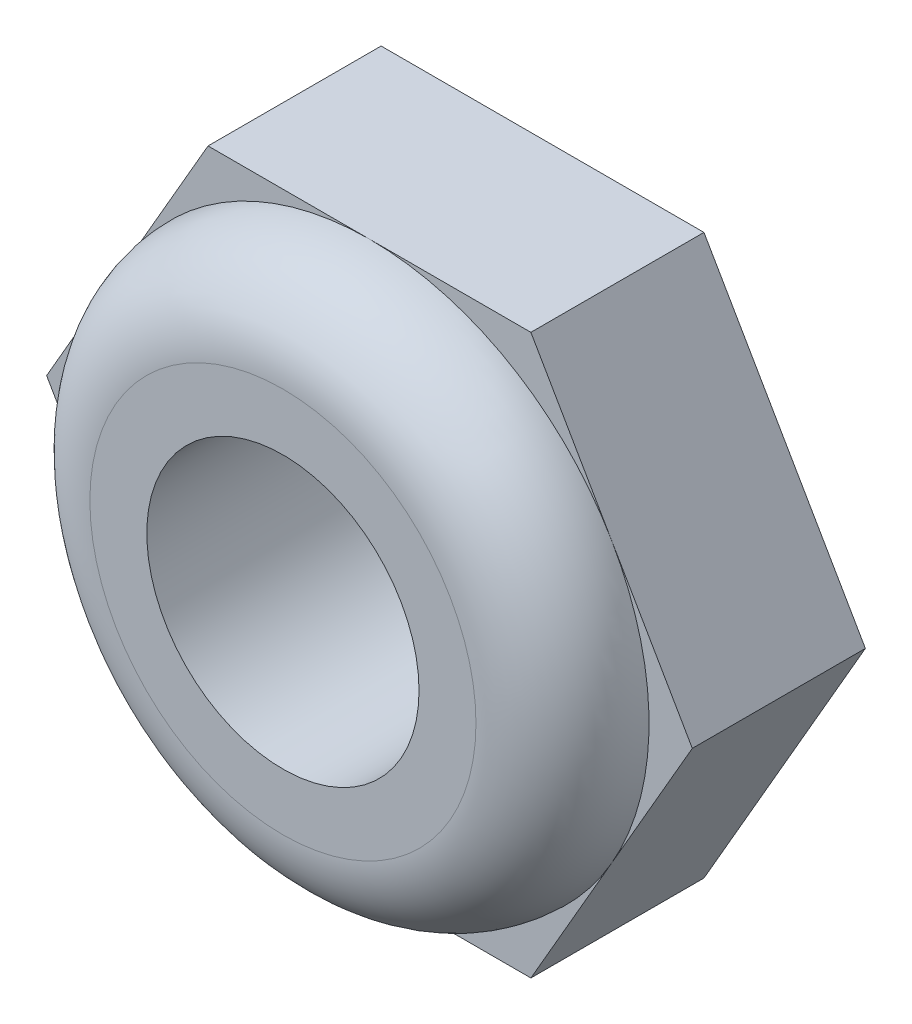
ISO-10303-21;
HEADER;
FILE_DESCRIPTION(('STEP AP214'),'2;1');
FILE_NAME('part.step','',(''),(''),'','','');
FILE_SCHEMA(('AUTOMOTIVE_DESIGN { 1 0 10303 214 1 1 1 1 }'));
ENDSEC;
DATA;
#1=APPLICATION_CONTEXT('core data for automotive mechanical design processes');
#2=APPLICATION_PROTOCOL_DEFINITION('international standard','automotive_design',2000,#1);
#3=PRODUCT_CONTEXT('',#1,'mechanical');
#4=PRODUCT('Part','Part','',(#3));
#5=PRODUCT_RELATED_PRODUCT_CATEGORY('part','',(#4));
#6=PRODUCT_DEFINITION_FORMATION('','',#4);
#7=PRODUCT_DEFINITION_CONTEXT('part definition',#1,'design');
#8=PRODUCT_DEFINITION('design','',#6,#7);
#9=PRODUCT_DEFINITION_SHAPE('','',#8);
#10=(LENGTH_UNIT() NAMED_UNIT(*) SI_UNIT(.MILLI.,.METRE.));
#11=(NAMED_UNIT(*) PLANE_ANGLE_UNIT() SI_UNIT($,.RADIAN.));
#12=(NAMED_UNIT(*) SI_UNIT($,.STERADIAN.) SOLID_ANGLE_UNIT());
#13=UNCERTAINTY_MEASURE_WITH_UNIT(LENGTH_MEASURE(1.E-05),#10,'distance_accuracy_value','');
#14=(GEOMETRIC_REPRESENTATION_CONTEXT(3) GLOBAL_UNCERTAINTY_ASSIGNED_CONTEXT((#13)) GLOBAL_UNIT_ASSIGNED_CONTEXT((#10,
#11,#12)) REPRESENTATION_CONTEXT('',''));
#15=CARTESIAN_POINT('',(0.,0.,0.));
#16=DIRECTION('',(0.,0.,1.));
#17=DIRECTION('',(1.,0.,0.));
#18=AXIS2_PLACEMENT_3D('',#15,#16,#17);
#19=CARTESIAN_POINT('',(0.,0.,5.159375));
#20=DIRECTION('',(0.,0.,1.));
#21=DIRECTION('',(1.,0.,0.));
#22=AXIS2_PLACEMENT_3D('',#19,#20,#21);
#23=PLANE('',#22);
#24=CARTESIAN_POINT('',(0.,0.,5.159375));
#25=DIRECTION('',(0.,0.,1.));
#26=DIRECTION('',(1.,0.,0.));
#27=AXIS2_PLACEMENT_3D('',#24,#25,#26);
#28=CIRCLE('',#27,2.7051);
#29=CARTESIAN_POINT('',(2.7051,0.,5.159375));
#30=VERTEX_POINT('',#29);
#31=EDGE_CURVE('E142',#30,#30,#28,.T.);
#32=ORIENTED_EDGE('',*,*,#31,.F.);
#33=EDGE_LOOP('',(#32));
#34=FACE_BOUND('',#33,.T.);
#35=CARTESIAN_POINT('',(0.,0.,5.159375));
#36=DIRECTION('',(0.,0.,-1.));
#37=DIRECTION('',(-1.,0.,0.));
#38=AXIS2_PLACEMENT_3D('',#35,#36,#37);
#39=CIRCLE('',#38,3.83645833333333);
#40=CARTESIAN_POINT('',(-3.83645833333333,0.,5.159375));
#41=VERTEX_POINT('',#40);
#42=EDGE_CURVE('E135',#41,#41,#39,.T.);
#43=ORIENTED_EDGE('',*,*,#42,.F.);
#44=EDGE_LOOP('',(#43));
#45=FACE_BOUND('',#44,.T.);
#46=ADVANCED_FACE('F32',(#34,#45),#23,.T.);
#47=CARTESIAN_POINT('',(0.,0.,0.));
#48=DIRECTION('',(0.,0.,1.));
#49=DIRECTION('',(1.,0.,0.));
#50=AXIS2_PLACEMENT_3D('',#47,#48,#49);
#51=PLANE('',#50);
#52=DIRECTION('',(-0.5,0.866025403784438,0.));
#53=VECTOR('',#52,1.);
#54=CARTESIAN_POINT('',(6.41580486636972,0.,0.));
#55=LINE('',#54,#53);
#56=CARTESIAN_POINT('',(6.41580486636972,0.,0.));
#57=VERTEX_POINT('',#56);
#58=CARTESIAN_POINT('',(3.20790243318486,5.55625,0.));
#59=VERTEX_POINT('',#58);
#60=EDGE_CURVE('E149',#57,#59,#55,.T.);
#61=ORIENTED_EDGE('',*,*,#60,.F.);
#62=DIRECTION('',(0.5,0.866025403784439,0.));
#63=VECTOR('',#62,1.);
#64=CARTESIAN_POINT('',(3.20790243318486,-5.55625,0.));
#65=LINE('',#64,#63);
#66=CARTESIAN_POINT('',(3.20790243318486,-5.55625,0.));
#67=VERTEX_POINT('',#66);
#68=EDGE_CURVE('E163',#67,#57,#65,.T.);
#69=ORIENTED_EDGE('',*,*,#68,.F.);
#70=DIRECTION('',(1.,0.,0.));
#71=VECTOR('',#70,1.);
#72=CARTESIAN_POINT('',(-3.20790243318486,-5.55625,0.));
#73=LINE('',#72,#71);
#74=CARTESIAN_POINT('',(-3.20790243318486,-5.55625,0.));
#75=VERTEX_POINT('',#74);
#76=EDGE_CURVE('E160',#75,#67,#73,.T.);
#77=ORIENTED_EDGE('',*,*,#76,.F.);
#78=DIRECTION('',(0.5,-0.866025403784438,0.));
#79=VECTOR('',#78,1.);
#80=CARTESIAN_POINT('',(-6.41580486636972,0.,0.));
#81=LINE('',#80,#79);
#82=CARTESIAN_POINT('',(-6.41580486636972,0.,0.));
#83=VERTEX_POINT('',#82);
#84=EDGE_CURVE('E157',#83,#75,#81,.T.);
#85=ORIENTED_EDGE('',*,*,#84,.F.);
#86=DIRECTION('',(-0.5,-0.866025403784439,0.));
#87=VECTOR('',#86,1.);
#88=CARTESIAN_POINT('',(-3.20790243318486,5.55625,0.));
#89=LINE('',#88,#87);
#90=CARTESIAN_POINT('',(-3.20790243318486,5.55625,0.));
#91=VERTEX_POINT('',#90);
#92=EDGE_CURVE('E155',#91,#83,#89,.T.);
#93=ORIENTED_EDGE('',*,*,#92,.F.);
#94=DIRECTION('',(-1.,0.,0.));
#95=VECTOR('',#94,1.);
#96=CARTESIAN_POINT('',(3.20790243318486,5.55625,0.));
#97=LINE('',#96,#95);
#98=EDGE_CURVE('E152',#59,#91,#97,.T.);
#99=ORIENTED_EDGE('',*,*,#98,.F.);
#100=EDGE_LOOP('',(#61,#69,#77,#85,#93,#99));
#101=FACE_BOUND('',#100,.T.);
#102=CARTESIAN_POINT('',(0.,0.,0.));
#103=DIRECTION('',(0.,0.,1.));
#104=DIRECTION('',(1.,0.,0.));
#105=AXIS2_PLACEMENT_3D('',#102,#103,#104);
#106=CIRCLE('',#105,2.7051);
#107=CARTESIAN_POINT('',(2.7051,0.,0.));
#108=VERTEX_POINT('',#107);
#109=EDGE_CURVE('E140',#108,#108,#106,.T.);
#110=ORIENTED_EDGE('',*,*,#109,.T.);
#111=EDGE_LOOP('',(#110));
#112=FACE_BOUND('',#111,.T.);
#113=ADVANCED_FACE('F190',(#101,#112),#51,.F.);
#114=CARTESIAN_POINT('',(6.41580486636972,0.,5.159375));
#115=DIRECTION('',(-0.866025403784438,-0.5,0.));
#116=DIRECTION('',(0.5,-0.866025403784438,0.));
#117=AXIS2_PLACEMENT_3D('',#114,#115,#116);
#118=PLANE('',#117);
#119=DIRECTION('',(0.,0.,-1.));
#120=VECTOR('',#119,1.);
#121=CARTESIAN_POINT('',(3.20790243318486,5.55625,5.159375));
#122=LINE('',#121,#120);
#123=CARTESIAN_POINT('',(3.20790243318486,5.55625,3.43958333333333));
#124=VERTEX_POINT('',#123);
#125=EDGE_CURVE('E172',#124,#59,#122,.T.);
#126=ORIENTED_EDGE('',*,*,#125,.F.);
#127=DIRECTION('',(0.5,-0.866025403784438,0.));
#128=VECTOR('',#127,1.);
#129=CARTESIAN_POINT('',(6.41580486636972,0.,3.43958333333333));
#130=LINE('',#129,#128);
#131=CARTESIAN_POINT('',(4.81185364977729,2.778125,3.43958333333333));
#132=VERTEX_POINT('',#131);
#133=EDGE_CURVE('E194',#124,#132,#130,.T.);
#134=ORIENTED_EDGE('',*,*,#133,.T.);
#135=CARTESIAN_POINT('',(6.41580486636972,0.,3.43958333333333));
#136=VERTEX_POINT('',#135);
#137=EDGE_CURVE('E195',#132,#136,#130,.T.);
#138=ORIENTED_EDGE('',*,*,#137,.T.);
#139=DIRECTION('',(0.,0.,-1.));
#140=VECTOR('',#139,1.);
#141=CARTESIAN_POINT('',(6.41580486636972,0.,5.159375));
#142=LINE('',#141,#140);
#143=EDGE_CURVE('E55',#136,#57,#142,.T.);
#144=ORIENTED_EDGE('',*,*,#143,.T.);
#145=ORIENTED_EDGE('',*,*,#60,.T.);
#146=EDGE_LOOP('',(#126,#134,#138,#144,#145));
#147=FACE_BOUND('',#146,.T.);
#148=ADVANCED_FACE('F34',(#147),#118,.F.);
#149=CARTESIAN_POINT('',(3.20790243318486,5.55625,5.159375));
#150=DIRECTION('',(0.,-1.,0.));
#151=DIRECTION('',(0.,0.,-1.));
#152=AXIS2_PLACEMENT_3D('',#149,#150,#151);
#153=PLANE('',#152);
#154=DIRECTION('',(0.,0.,-1.));
#155=VECTOR('',#154,1.);
#156=CARTESIAN_POINT('',(-3.20790243318486,5.55625,5.159375));
#157=LINE('',#156,#155);
#158=CARTESIAN_POINT('',(-3.20790243318486,5.55625,3.43958333333333));
#159=VERTEX_POINT('',#158);
#160=EDGE_CURVE('E171',#159,#91,#157,.T.);
#161=ORIENTED_EDGE('',*,*,#160,.F.);
#162=DIRECTION('',(1.,0.,0.));
#163=VECTOR('',#162,1.);
#164=CARTESIAN_POINT('',(3.20790243318486,5.55625,3.43958333333333));
#165=LINE('',#164,#163);
#166=CARTESIAN_POINT('',(0.,5.55625,3.43958333333333));
#167=VERTEX_POINT('',#166);
#168=EDGE_CURVE('E112',#159,#167,#165,.T.);
#169=ORIENTED_EDGE('',*,*,#168,.T.);
#170=EDGE_CURVE('E146',#167,#124,#165,.T.);
#171=ORIENTED_EDGE('',*,*,#170,.T.);
#172=ORIENTED_EDGE('',*,*,#125,.T.);
#173=ORIENTED_EDGE('',*,*,#98,.T.);
#174=EDGE_LOOP('',(#161,#169,#171,#172,#173));
#175=FACE_BOUND('',#174,.T.);
#176=ADVANCED_FACE('F204',(#175),#153,.F.);
#177=CARTESIAN_POINT('',(-3.20790243318486,5.55625,5.159375));
#178=DIRECTION('',(0.866025403784439,-0.5,0.));
#179=DIRECTION('',(0.5,0.866025403784439,0.));
#180=AXIS2_PLACEMENT_3D('',#177,#178,#179);
#181=PLANE('',#180);
#182=DIRECTION('',(0.,0.,-1.));
#183=VECTOR('',#182,1.);
#184=CARTESIAN_POINT('',(-6.41580486636972,0.,5.159375));
#185=LINE('',#184,#183);
#186=CARTESIAN_POINT('',(-6.41580486636972,0.,3.43958333333333));
#187=VERTEX_POINT('',#186);
#188=EDGE_CURVE('E139',#187,#83,#185,.T.);
#189=ORIENTED_EDGE('',*,*,#188,.F.);
#190=DIRECTION('',(0.5,0.866025403784439,0.));
#191=VECTOR('',#190,1.);
#192=CARTESIAN_POINT('',(-3.20790243318486,5.55625,3.43958333333333));
#193=LINE('',#192,#191);
#194=CARTESIAN_POINT('',(-4.81185364977729,2.778125,3.43958333333333));
#195=VERTEX_POINT('',#194);
#196=EDGE_CURVE('E116',#187,#195,#193,.T.);
#197=ORIENTED_EDGE('',*,*,#196,.T.);
#198=EDGE_CURVE('E106',#195,#159,#193,.T.);
#199=ORIENTED_EDGE('',*,*,#198,.T.);
#200=ORIENTED_EDGE('',*,*,#160,.T.);
#201=ORIENTED_EDGE('',*,*,#92,.T.);
#202=EDGE_LOOP('',(#189,#197,#199,#200,#201));
#203=FACE_BOUND('',#202,.T.);
#204=ADVANCED_FACE('F137',(#203),#181,.F.);
#205=CARTESIAN_POINT('',(-6.41580486636972,0.,5.159375));
#206=DIRECTION('',(0.866025403784438,0.5,0.));
#207=DIRECTION('',(-0.5,0.866025403784438,0.));
#208=AXIS2_PLACEMENT_3D('',#205,#206,#207);
#209=PLANE('',#208);
#210=DIRECTION('',(0.,0.,-1.));
#211=VECTOR('',#210,1.);
#212=CARTESIAN_POINT('',(-3.20790243318486,-5.55625,5.159375));
#213=LINE('',#212,#211);
#214=CARTESIAN_POINT('',(-3.20790243318486,-5.55625,3.43958333333333));
#215=VERTEX_POINT('',#214);
#216=EDGE_CURVE('E168',#215,#75,#213,.T.);
#217=ORIENTED_EDGE('',*,*,#216,.F.);
#218=DIRECTION('',(-0.5,0.866025403784438,0.));
#219=VECTOR('',#218,1.);
#220=CARTESIAN_POINT('',(-6.41580486636972,0.,3.43958333333333));
#221=LINE('',#220,#219);
#222=CARTESIAN_POINT('',(-4.81185364977729,-2.778125,3.43958333333333));
#223=VERTEX_POINT('',#222);
#224=EDGE_CURVE('E199',#215,#223,#221,.T.);
#225=ORIENTED_EDGE('',*,*,#224,.T.);
#226=EDGE_CURVE('E117',#223,#187,#221,.T.);
#227=ORIENTED_EDGE('',*,*,#226,.T.);
#228=ORIENTED_EDGE('',*,*,#188,.T.);
#229=ORIENTED_EDGE('',*,*,#84,.T.);
#230=EDGE_LOOP('',(#217,#225,#227,#228,#229));
#231=FACE_BOUND('',#230,.T.);
#232=ADVANCED_FACE('F205',(#231),#209,.F.);
#233=CARTESIAN_POINT('',(-3.20790243318486,-5.55625,5.159375));
#234=DIRECTION('',(0.,1.,0.));
#235=DIRECTION('',(-1.,0.,0.));
#236=AXIS2_PLACEMENT_3D('',#233,#234,#235);
#237=PLANE('',#236);
#238=DIRECTION('',(0.,0.,-1.));
#239=VECTOR('',#238,1.);
#240=CARTESIAN_POINT('',(3.20790243318486,-5.55625,5.159375));
#241=LINE('',#240,#239);
#242=CARTESIAN_POINT('',(3.20790243318486,-5.55625,3.43958333333333));
#243=VERTEX_POINT('',#242);
#244=EDGE_CURVE('E166',#243,#67,#241,.T.);
#245=ORIENTED_EDGE('',*,*,#244,.F.);
#246=DIRECTION('',(-1.,0.,0.));
#247=VECTOR('',#246,1.);
#248=CARTESIAN_POINT('',(-3.20790243318486,-5.55625,3.43958333333333));
#249=LINE('',#248,#247);
#250=CARTESIAN_POINT('',(0.,-5.55625,3.43958333333333));
#251=VERTEX_POINT('',#250);
#252=EDGE_CURVE('E47',#243,#251,#249,.T.);
#253=ORIENTED_EDGE('',*,*,#252,.T.);
#254=EDGE_CURVE('E197',#251,#215,#249,.T.);
#255=ORIENTED_EDGE('',*,*,#254,.T.);
#256=ORIENTED_EDGE('',*,*,#216,.T.);
#257=ORIENTED_EDGE('',*,*,#76,.T.);
#258=EDGE_LOOP('',(#245,#253,#255,#256,#257));
#259=FACE_BOUND('',#258,.T.);
#260=ADVANCED_FACE('F182',(#259),#237,.F.);
#261=CARTESIAN_POINT('',(3.20790243318486,-5.55625,5.159375));
#262=DIRECTION('',(-0.866025403784439,0.5,0.));
#263=DIRECTION('',(-0.5,-0.866025403784439,0.));
#264=AXIS2_PLACEMENT_3D('',#261,#262,#263);
#265=PLANE('',#264);
#266=ORIENTED_EDGE('',*,*,#143,.F.);
#267=DIRECTION('',(-0.5,-0.866025403784439,0.));
#268=VECTOR('',#267,1.);
#269=CARTESIAN_POINT('',(3.20790243318486,-5.55625,3.43958333333333));
#270=LINE('',#269,#268);
#271=CARTESIAN_POINT('',(4.81185364977729,-2.778125,3.43958333333333));
#272=VERTEX_POINT('',#271);
#273=EDGE_CURVE('E11',#136,#272,#270,.T.);
#274=ORIENTED_EDGE('',*,*,#273,.T.);
#275=EDGE_CURVE('E36',#272,#243,#270,.T.);
#276=ORIENTED_EDGE('',*,*,#275,.T.);
#277=ORIENTED_EDGE('',*,*,#244,.T.);
#278=ORIENTED_EDGE('',*,*,#68,.T.);
#279=EDGE_LOOP('',(#266,#274,#276,#277,#278));
#280=FACE_BOUND('',#279,.T.);
#281=ADVANCED_FACE('F179',(#280),#265,.F.);
#282=CARTESIAN_POINT('',(0.,0.,5.159375));
#283=DIRECTION('',(0.,0.,-1.));
#284=DIRECTION('',(-1.,0.,0.));
#285=AXIS2_PLACEMENT_3D('',#282,#283,#284);
#286=CYLINDRICAL_SURFACE('',#285,2.7051);
#287=ORIENTED_EDGE('',*,*,#31,.T.);
#288=EDGE_LOOP('',(#287));
#289=FACE_BOUND('',#288,.T.);
#290=ORIENTED_EDGE('',*,*,#109,.F.);
#291=EDGE_LOOP('',(#290));
#292=FACE_BOUND('',#291,.T.);
#293=ADVANCED_FACE('F224',(#289,#292),#286,.F.);
#294=CARTESIAN_POINT('',(0.,8.334375,3.43958333333333));
#295=DIRECTION('',(0.,0.,-1.));
#296=DIRECTION('',(-1.,0.,0.));
#297=AXIS2_PLACEMENT_3D('',#294,#295,#296);
#298=PLANE('',#297);
#299=ORIENTED_EDGE('',*,*,#226,.F.);
#300=CARTESIAN_POINT('',(0.,0.,3.43958333333333));
#301=DIRECTION('',(0.,0.,-1.));
#302=DIRECTION('',(-1.,0.,0.));
#303=AXIS2_PLACEMENT_3D('',#300,#301,#302);
#304=CIRCLE('',#303,5.55625);
#305=EDGE_CURVE('E121',#223,#195,#304,.T.);
#306=ORIENTED_EDGE('',*,*,#305,.T.);
#307=ORIENTED_EDGE('',*,*,#196,.F.);
#308=EDGE_LOOP('',(#299,#306,#307));
#309=FACE_BOUND('',#308,.T.);
#310=ADVANCED_FACE('F122',(#309),#298,.F.);
#311=EDGE_CURVE('E110',#195,#167,#304,.T.);
#312=ORIENTED_EDGE('',*,*,#311,.T.);
#313=ORIENTED_EDGE('',*,*,#168,.F.);
#314=ORIENTED_EDGE('',*,*,#198,.F.);
#315=EDGE_LOOP('',(#312,#313,#314));
#316=FACE_BOUND('',#315,.T.);
#317=ADVANCED_FACE('F108',(#316),#298,.F.);
#318=EDGE_CURVE('E134',#167,#132,#304,.T.);
#319=ORIENTED_EDGE('',*,*,#318,.T.);
#320=ORIENTED_EDGE('',*,*,#133,.F.);
#321=ORIENTED_EDGE('',*,*,#170,.F.);
#322=EDGE_LOOP('',(#319,#320,#321));
#323=FACE_BOUND('',#322,.T.);
#324=ADVANCED_FACE('F242',(#323),#298,.F.);
#325=ORIENTED_EDGE('',*,*,#254,.F.);
#326=EDGE_CURVE('E127',#251,#223,#304,.T.);
#327=ORIENTED_EDGE('',*,*,#326,.T.);
#328=ORIENTED_EDGE('',*,*,#224,.F.);
#329=EDGE_LOOP('',(#325,#327,#328));
#330=FACE_BOUND('',#329,.T.);
#331=ADVANCED_FACE('F249',(#330),#298,.F.);
#332=EDGE_CURVE('E256',#132,#272,#304,.T.);
#333=ORIENTED_EDGE('',*,*,#332,.T.);
#334=ORIENTED_EDGE('',*,*,#273,.F.);
#335=ORIENTED_EDGE('',*,*,#137,.F.);
#336=EDGE_LOOP('',(#333,#334,#335));
#337=FACE_BOUND('',#336,.T.);
#338=ADVANCED_FACE('F244',(#337),#298,.F.);
#339=ORIENTED_EDGE('',*,*,#275,.F.);
#340=EDGE_CURVE('E257',#272,#251,#304,.T.);
#341=ORIENTED_EDGE('',*,*,#340,.T.);
#342=ORIENTED_EDGE('',*,*,#252,.F.);
#343=EDGE_LOOP('',(#339,#341,#342));
#344=FACE_BOUND('',#343,.T.);
#345=ADVANCED_FACE('F236',(#344),#298,.F.);
#346=CARTESIAN_POINT('',(0.,0.,3.43958333333333));
#347=DIRECTION('',(0.,0.,-1.));
#348=DIRECTION('',(-1.,0.,0.));
#349=AXIS2_PLACEMENT_3D('',#346,#347,#348);
#350=TOROIDAL_SURFACE('',#349,3.83645833333333,1.71979166666667);
#351=ORIENTED_EDGE('',*,*,#311,.F.);
#352=ORIENTED_EDGE('',*,*,#305,.F.);
#353=ORIENTED_EDGE('',*,*,#326,.F.);
#354=ORIENTED_EDGE('',*,*,#340,.F.);
#355=ORIENTED_EDGE('',*,*,#332,.F.);
#356=ORIENTED_EDGE('',*,*,#318,.F.);
#357=EDGE_LOOP('',(#351,#352,#353,#354,#355,#356));
#358=FACE_BOUND('',#357,.T.);
#359=ORIENTED_EDGE('',*,*,#42,.T.);
#360=EDGE_LOOP('',(#359));
#361=FACE_BOUND('',#360,.T.);
#362=ADVANCED_FACE('F130',(#358,#361),#350,.T.);
#363=CLOSED_SHELL('',(#46,#113,#148,#176,#204,#232,#260,#281,#293,#310,#317,#324,#331,#338,#345,#362));
#364=MANIFOLD_SOLID_BREP('B2',#363);
#365=ADVANCED_BREP_SHAPE_REPRESENTATION('',(#18,#364),#14);
#366=SHAPE_DEFINITION_REPRESENTATION(#9,#365);
ENDSEC;
END-ISO-10303-21;
